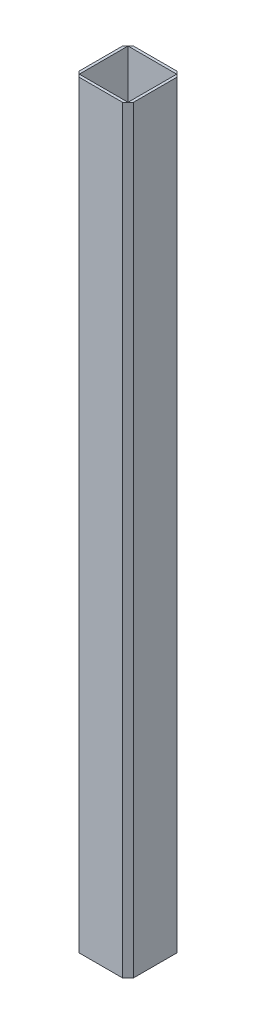
ISO-10303-21;
HEADER;
FILE_DESCRIPTION(('STEP AP214'),'2;1');
FILE_NAME('part.step','',(''),(''),'','','');
FILE_SCHEMA(('AUTOMOTIVE_DESIGN { 1 0 10303 214 1 1 1 1 }'));
ENDSEC;
DATA;
#1=APPLICATION_CONTEXT('core data for automotive mechanical design processes');
#2=APPLICATION_PROTOCOL_DEFINITION('international standard','automotive_design',2000,#1);
#3=PRODUCT_CONTEXT('',#1,'mechanical');
#4=PRODUCT('Part','Part','',(#3));
#5=PRODUCT_RELATED_PRODUCT_CATEGORY('part','',(#4));
#6=PRODUCT_DEFINITION_FORMATION('','',#4);
#7=PRODUCT_DEFINITION_CONTEXT('part definition',#1,'design');
#8=PRODUCT_DEFINITION('design','',#6,#7);
#9=PRODUCT_DEFINITION_SHAPE('','',#8);
#10=(LENGTH_UNIT() NAMED_UNIT(*) SI_UNIT(.MILLI.,.METRE.));
#11=(NAMED_UNIT(*) PLANE_ANGLE_UNIT() SI_UNIT($,.RADIAN.));
#12=(NAMED_UNIT(*) SI_UNIT($,.STERADIAN.) SOLID_ANGLE_UNIT());
#13=UNCERTAINTY_MEASURE_WITH_UNIT(LENGTH_MEASURE(1.E-05),#10,'distance_accuracy_value','');
#14=(GEOMETRIC_REPRESENTATION_CONTEXT(3) GLOBAL_UNCERTAINTY_ASSIGNED_CONTEXT((#13)) GLOBAL_UNIT_ASSIGNED_CONTEXT((#10,
#11,#12)) REPRESENTATION_CONTEXT('',''));
#15=CARTESIAN_POINT('',(0.,0.,0.));
#16=DIRECTION('',(0.,0.,1.));
#17=DIRECTION('',(1.,0.,0.));
#18=AXIS2_PLACEMENT_3D('',#15,#16,#17);
#19=CARTESIAN_POINT('',(0.,700.,50.));
#20=DIRECTION('',(0.,-1.,0.));
#21=DIRECTION('',(0.,0.,-1.));
#22=AXIS2_PLACEMENT_3D('',#19,#20,#21);
#23=PLANE('',#22);
#24=DIRECTION('',(0.,0.,-1.));
#25=VECTOR('',#24,1.);
#26=CARTESIAN_POINT('',(0.,700.,50.));
#27=LINE('',#26,#25);
#28=CARTESIAN_POINT('',(0.,700.,45.));
#29=VERTEX_POINT('',#28);
#30=CARTESIAN_POINT('',(0.,700.,5.00000000000006));
#31=VERTEX_POINT('',#30);
#32=EDGE_CURVE('E248',#29,#31,#27,.T.);
#33=ORIENTED_EDGE('',*,*,#32,.F.);
#34=DIRECTION('',(-0.707106781186551,0.,-0.707106781186544));
#35=VECTOR('',#34,1.);
#36=CARTESIAN_POINT('',(5.00000000000006,700.,50.));
#37=LINE('',#36,#35);
#38=CARTESIAN_POINT('',(2.5,700.,47.5));
#39=VERTEX_POINT('',#38);
#40=EDGE_CURVE('E230',#29,#39,#37,.F.);
#41=ORIENTED_EDGE('',*,*,#40,.T.);
#42=DIRECTION('',(0.,0.,-1.));
#43=VECTOR('',#42,1.);
#44=CARTESIAN_POINT('',(2.5,700.,47.5));
#45=LINE('',#44,#43);
#46=CARTESIAN_POINT('',(2.5,700.,2.5));
#47=VERTEX_POINT('',#46);
#48=EDGE_CURVE('E317',#39,#47,#45,.T.);
#49=ORIENTED_EDGE('',*,*,#48,.T.);
#50=DIRECTION('',(-0.707106781186544,0.,0.707106781186551));
#51=VECTOR('',#50,1.);
#52=CARTESIAN_POINT('',(0.,700.,5.00000000000006));
#53=LINE('',#52,#51);
#54=EDGE_CURVE('E221',#47,#31,#53,.T.);
#55=ORIENTED_EDGE('',*,*,#54,.T.);
#56=EDGE_LOOP('',(#33,#41,#49,#55));
#57=FACE_BOUND('',#56,.T.);
#58=ADVANCED_FACE('F44',(#57),#23,.F.);
#59=DIRECTION('',(-1.,0.,0.));
#60=VECTOR('',#59,1.);
#61=CARTESIAN_POINT('',(0.,700.,0.));
#62=LINE('',#61,#60);
#63=CARTESIAN_POINT('',(45.,700.,0.));
#64=VERTEX_POINT('',#63);
#65=CARTESIAN_POINT('',(5.,700.,0.));
#66=VERTEX_POINT('',#65);
#67=EDGE_CURVE('E291',#64,#66,#62,.T.);
#68=ORIENTED_EDGE('',*,*,#67,.T.);
#69=DIRECTION('',(-0.707106781186544,0.,0.707106781186551));
#70=VECTOR('',#69,1.);
#71=CARTESIAN_POINT('',(0.,700.,5.00000000000006));
#72=LINE('',#71,#70);
#73=EDGE_CURVE('E224',#66,#47,#72,.T.);
#74=ORIENTED_EDGE('',*,*,#73,.T.);
#75=DIRECTION('',(1.,0.,0.));
#76=VECTOR('',#75,1.);
#77=CARTESIAN_POINT('',(2.5,700.,2.5));
#78=LINE('',#77,#76);
#79=CARTESIAN_POINT('',(47.5,700.,2.5));
#80=VERTEX_POINT('',#79);
#81=EDGE_CURVE('E174',#47,#80,#78,.T.);
#82=ORIENTED_EDGE('',*,*,#81,.T.);
#83=DIRECTION('',(-0.707106781186544,0.,-0.707106781186551));
#84=VECTOR('',#83,1.);
#85=CARTESIAN_POINT('',(50.,700.,5.00000000000006));
#86=LINE('',#85,#84);
#87=EDGE_CURVE('E211',#80,#64,#86,.T.);
#88=ORIENTED_EDGE('',*,*,#87,.T.);
#89=EDGE_LOOP('',(#68,#74,#82,#88));
#90=FACE_BOUND('',#89,.T.);
#91=ADVANCED_FACE('F332',(#90),#23,.F.);
#92=DIRECTION('',(-1.,0.,0.));
#93=VECTOR('',#92,1.);
#94=CARTESIAN_POINT('',(47.5,700.,47.5));
#95=LINE('',#94,#93);
#96=CARTESIAN_POINT('',(47.5,700.,47.5));
#97=VERTEX_POINT('',#96);
#98=EDGE_CURVE('E164',#97,#39,#95,.T.);
#99=ORIENTED_EDGE('',*,*,#98,.T.);
#100=DIRECTION('',(-0.707106781186551,0.,-0.707106781186544));
#101=VECTOR('',#100,1.);
#102=CARTESIAN_POINT('',(5.00000000000006,700.,50.));
#103=LINE('',#102,#101);
#104=CARTESIAN_POINT('',(5.00000000000006,700.,50.));
#105=VERTEX_POINT('',#104);
#106=EDGE_CURVE('E227',#39,#105,#103,.F.);
#107=ORIENTED_EDGE('',*,*,#106,.T.);
#108=DIRECTION('',(-1.,0.,0.));
#109=VECTOR('',#108,1.);
#110=CARTESIAN_POINT('',(0.,700.,50.));
#111=LINE('',#110,#109);
#112=CARTESIAN_POINT('',(44.9999999999999,700.,50.));
#113=VERTEX_POINT('',#112);
#114=EDGE_CURVE('E254',#113,#105,#111,.T.);
#115=ORIENTED_EDGE('',*,*,#114,.F.);
#116=DIRECTION('',(-0.707106781186544,0.,0.707106781186551));
#117=VECTOR('',#116,1.);
#118=CARTESIAN_POINT('',(44.9999999999999,700.,50.));
#119=LINE('',#118,#117);
#120=EDGE_CURVE('E218',#113,#97,#119,.F.);
#121=ORIENTED_EDGE('',*,*,#120,.T.);
#122=EDGE_LOOP('',(#99,#107,#115,#121));
#123=FACE_BOUND('',#122,.T.);
#124=ADVANCED_FACE('F297',(#123),#23,.F.);
#125=CARTESIAN_POINT('',(0.,0.,50.));
#126=DIRECTION('',(0.,1.,0.));
#127=DIRECTION('',(0.,0.,1.));
#128=AXIS2_PLACEMENT_3D('',#125,#126,#127);
#129=PLANE('',#128);
#130=DIRECTION('',(1.,0.,0.));
#131=VECTOR('',#130,1.);
#132=CARTESIAN_POINT('',(0.,0.,50.));
#133=LINE('',#132,#131);
#134=CARTESIAN_POINT('',(5.00000000000006,0.,50.));
#135=VERTEX_POINT('',#134);
#136=CARTESIAN_POINT('',(44.9999999999999,0.,50.));
#137=VERTEX_POINT('',#136);
#138=EDGE_CURVE('E279',#135,#137,#133,.T.);
#139=ORIENTED_EDGE('',*,*,#138,.F.);
#140=DIRECTION('',(0.707106781186551,0.,0.707106781186544));
#141=VECTOR('',#140,1.);
#142=CARTESIAN_POINT('',(5.00000000000006,0.,50.));
#143=LINE('',#142,#141);
#144=CARTESIAN_POINT('',(2.5,0.,47.5));
#145=VERTEX_POINT('',#144);
#146=EDGE_CURVE('E202',#135,#145,#143,.F.);
#147=ORIENTED_EDGE('',*,*,#146,.T.);
#148=DIRECTION('',(-1.,0.,0.));
#149=VECTOR('',#148,1.);
#150=CARTESIAN_POINT('',(47.5,0.,47.5));
#151=LINE('',#150,#149);
#152=CARTESIAN_POINT('',(47.5,0.,47.5));
#153=VERTEX_POINT('',#152);
#154=EDGE_CURVE('E281',#153,#145,#151,.T.);
#155=ORIENTED_EDGE('',*,*,#154,.F.);
#156=DIRECTION('',(0.707106781186544,0.,-0.707106781186551));
#157=VECTOR('',#156,1.);
#158=CARTESIAN_POINT('',(44.9999999999999,0.,50.));
#159=LINE('',#158,#157);
#160=EDGE_CURVE('E196',#153,#137,#159,.F.);
#161=ORIENTED_EDGE('',*,*,#160,.T.);
#162=EDGE_LOOP('',(#139,#147,#155,#161));
#163=FACE_BOUND('',#162,.T.);
#164=ADVANCED_FACE('F278',(#163),#129,.F.);
#165=DIRECTION('',(0.,0.,-1.));
#166=VECTOR('',#165,1.);
#167=CARTESIAN_POINT('',(2.5,0.,47.5));
#168=LINE('',#167,#166);
#169=CARTESIAN_POINT('',(2.5,0.,2.5));
#170=VERTEX_POINT('',#169);
#171=EDGE_CURVE('E140',#145,#170,#168,.T.);
#172=ORIENTED_EDGE('',*,*,#171,.F.);
#173=DIRECTION('',(0.707106781186551,0.,0.707106781186544));
#174=VECTOR('',#173,1.);
#175=CARTESIAN_POINT('',(5.00000000000006,0.,50.));
#176=LINE('',#175,#174);
#177=CARTESIAN_POINT('',(0.,0.,45.));
#178=VERTEX_POINT('',#177);
#179=EDGE_CURVE('E149',#145,#178,#176,.F.);
#180=ORIENTED_EDGE('',*,*,#179,.T.);
#181=DIRECTION('',(0.,0.,-1.));
#182=VECTOR('',#181,1.);
#183=CARTESIAN_POINT('',(0.,0.,50.));
#184=LINE('',#183,#182);
#185=CARTESIAN_POINT('',(0.,0.,5.00000000000006));
#186=VERTEX_POINT('',#185);
#187=EDGE_CURVE('E143',#178,#186,#184,.T.);
#188=ORIENTED_EDGE('',*,*,#187,.T.);
#189=DIRECTION('',(0.707106781186544,0.,-0.707106781186551));
#190=VECTOR('',#189,1.);
#191=CARTESIAN_POINT('',(0.,0.,5.00000000000006));
#192=LINE('',#191,#190);
#193=EDGE_CURVE('E137',#186,#170,#192,.T.);
#194=ORIENTED_EDGE('',*,*,#193,.T.);
#195=EDGE_LOOP('',(#172,#180,#188,#194));
#196=FACE_BOUND('',#195,.T.);
#197=ADVANCED_FACE('F139',(#196),#129,.F.);
#198=DIRECTION('',(0.,0.,-1.));
#199=VECTOR('',#198,1.);
#200=CARTESIAN_POINT('',(50.,0.,50.));
#201=LINE('',#200,#199);
#202=CARTESIAN_POINT('',(50.,0.,44.9999999999999));
#203=VERTEX_POINT('',#202);
#204=CARTESIAN_POINT('',(50.,0.,5.00000000000006));
#205=VERTEX_POINT('',#204);
#206=EDGE_CURVE('E244',#203,#205,#201,.T.);
#207=ORIENTED_EDGE('',*,*,#206,.F.);
#208=DIRECTION('',(0.707106781186544,0.,-0.707106781186551));
#209=VECTOR('',#208,1.);
#210=CARTESIAN_POINT('',(44.9999999999999,0.,50.));
#211=LINE('',#210,#209);
#212=EDGE_CURVE('E193',#203,#153,#211,.F.);
#213=ORIENTED_EDGE('',*,*,#212,.T.);
#214=DIRECTION('',(0.,0.,1.));
#215=VECTOR('',#214,1.);
#216=CARTESIAN_POINT('',(47.5,0.,2.5));
#217=LINE('',#216,#215);
#218=CARTESIAN_POINT('',(47.5,0.,2.5));
#219=VERTEX_POINT('',#218);
#220=EDGE_CURVE('E186',#219,#153,#217,.T.);
#221=ORIENTED_EDGE('',*,*,#220,.F.);
#222=DIRECTION('',(0.707106781186544,0.,0.707106781186551));
#223=VECTOR('',#222,1.);
#224=CARTESIAN_POINT('',(50.,0.,5.00000000000006));
#225=LINE('',#224,#223);
#226=EDGE_CURVE('E268',#219,#205,#225,.T.);
#227=ORIENTED_EDGE('',*,*,#226,.T.);
#228=EDGE_LOOP('',(#207,#213,#221,#227));
#229=FACE_BOUND('',#228,.T.);
#230=ADVANCED_FACE('F371',(#229),#129,.F.);
#231=DIRECTION('',(1.,0.,0.));
#232=VECTOR('',#231,1.);
#233=CARTESIAN_POINT('',(2.5,0.,2.5));
#234=LINE('',#233,#232);
#235=EDGE_CURVE('E163',#170,#219,#234,.T.);
#236=ORIENTED_EDGE('',*,*,#235,.F.);
#237=DIRECTION('',(0.707106781186544,0.,-0.707106781186551));
#238=VECTOR('',#237,1.);
#239=CARTESIAN_POINT('',(0.,0.,5.00000000000006));
#240=LINE('',#239,#238);
#241=CARTESIAN_POINT('',(5.,0.,0.));
#242=VERTEX_POINT('',#241);
#243=EDGE_CURVE('E150',#170,#242,#240,.T.);
#244=ORIENTED_EDGE('',*,*,#243,.T.);
#245=DIRECTION('',(1.,0.,0.));
#246=VECTOR('',#245,1.);
#247=CARTESIAN_POINT('',(0.,0.,0.));
#248=LINE('',#247,#246);
#249=CARTESIAN_POINT('',(45.,0.,0.));
#250=VERTEX_POINT('',#249);
#251=EDGE_CURVE('E176',#242,#250,#248,.T.);
#252=ORIENTED_EDGE('',*,*,#251,.T.);
#253=DIRECTION('',(0.707106781186544,0.,0.707106781186551));
#254=VECTOR('',#253,1.);
#255=CARTESIAN_POINT('',(50.,0.,5.00000000000006));
#256=LINE('',#255,#254);
#257=EDGE_CURVE('E184',#250,#219,#256,.T.);
#258=ORIENTED_EDGE('',*,*,#257,.T.);
#259=EDGE_LOOP('',(#236,#244,#252,#258));
#260=FACE_BOUND('',#259,.T.);
#261=ADVANCED_FACE('F180',(#260),#129,.F.);
#262=DIRECTION('',(0.,0.,1.));
#263=VECTOR('',#262,1.);
#264=CARTESIAN_POINT('',(47.5,700.,2.5));
#265=LINE('',#264,#263);
#266=EDGE_CURVE('E306',#80,#97,#265,.T.);
#267=ORIENTED_EDGE('',*,*,#266,.T.);
#268=DIRECTION('',(-0.707106781186544,0.,0.707106781186551));
#269=VECTOR('',#268,1.);
#270=CARTESIAN_POINT('',(44.9999999999999,700.,50.));
#271=LINE('',#270,#269);
#272=CARTESIAN_POINT('',(50.,700.,44.9999999999999));
#273=VERTEX_POINT('',#272);
#274=EDGE_CURVE('E69',#97,#273,#271,.F.);
#275=ORIENTED_EDGE('',*,*,#274,.T.);
#276=DIRECTION('',(0.,0.,-1.));
#277=VECTOR('',#276,1.);
#278=CARTESIAN_POINT('',(50.,700.,50.));
#279=LINE('',#278,#277);
#280=CARTESIAN_POINT('',(50.,700.,5.00000000000006));
#281=VERTEX_POINT('',#280);
#282=EDGE_CURVE('E241',#273,#281,#279,.T.);
#283=ORIENTED_EDGE('',*,*,#282,.T.);
#284=DIRECTION('',(-0.707106781186544,0.,-0.707106781186551));
#285=VECTOR('',#284,1.);
#286=CARTESIAN_POINT('',(50.,700.,5.00000000000006));
#287=LINE('',#286,#285);
#288=EDGE_CURVE('E61',#281,#80,#287,.T.);
#289=ORIENTED_EDGE('',*,*,#288,.T.);
#290=EDGE_LOOP('',(#267,#275,#283,#289));
#291=FACE_BOUND('',#290,.T.);
#292=ADVANCED_FACE('F246',(#291),#23,.F.);
#293=CARTESIAN_POINT('',(0.,0.,50.));
#294=DIRECTION('',(1.,0.,0.));
#295=DIRECTION('',(0.,0.,-1.));
#296=AXIS2_PLACEMENT_3D('',#293,#294,#295);
#297=PLANE('',#296);
#298=ORIENTED_EDGE('',*,*,#187,.F.);
#299=DIRECTION('',(0.,1.,0.));
#300=VECTOR('',#299,1.);
#301=CARTESIAN_POINT('',(0.,0.,45.));
#302=LINE('',#301,#300);
#303=EDGE_CURVE('E208',#178,#29,#302,.T.);
#304=ORIENTED_EDGE('',*,*,#303,.T.);
#305=ORIENTED_EDGE('',*,*,#32,.T.);
#306=DIRECTION('',(0.,-1.,0.));
#307=VECTOR('',#306,1.);
#308=CARTESIAN_POINT('',(0.,0.,5.00000000000006));
#309=LINE('',#308,#307);
#310=EDGE_CURVE('E205',#31,#186,#309,.T.);
#311=ORIENTED_EDGE('',*,*,#310,.T.);
#312=EDGE_LOOP('',(#298,#304,#305,#311));
#313=FACE_BOUND('',#312,.T.);
#314=ADVANCED_FACE('F340',(#313),#297,.F.);
#315=CARTESIAN_POINT('',(50.,0.,50.));
#316=DIRECTION('',(-1.,0.,0.));
#317=DIRECTION('',(0.,0.,1.));
#318=AXIS2_PLACEMENT_3D('',#315,#316,#317);
#319=PLANE('',#318);
#320=ORIENTED_EDGE('',*,*,#282,.F.);
#321=DIRECTION('',(0.,-1.,0.));
#322=VECTOR('',#321,1.);
#323=CARTESIAN_POINT('',(50.,0.,44.9999999999999));
#324=LINE('',#323,#322);
#325=EDGE_CURVE('E11',#273,#203,#324,.T.);
#326=ORIENTED_EDGE('',*,*,#325,.T.);
#327=ORIENTED_EDGE('',*,*,#206,.T.);
#328=DIRECTION('',(0.,1.,0.));
#329=VECTOR('',#328,1.);
#330=CARTESIAN_POINT('',(50.,700.,5.00000000000006));
#331=LINE('',#330,#329);
#332=EDGE_CURVE('E54',#205,#281,#331,.T.);
#333=ORIENTED_EDGE('',*,*,#332,.T.);
#334=EDGE_LOOP('',(#320,#326,#327,#333));
#335=FACE_BOUND('',#334,.T.);
#336=ADVANCED_FACE('F240',(#335),#319,.F.);
#337=CARTESIAN_POINT('',(0.,0.,50.));
#338=DIRECTION('',(0.,0.,-1.));
#339=DIRECTION('',(-1.,0.,0.));
#340=AXIS2_PLACEMENT_3D('',#337,#338,#339);
#341=PLANE('',#340);
#342=ORIENTED_EDGE('',*,*,#114,.T.);
#343=DIRECTION('',(0.,-1.,0.));
#344=VECTOR('',#343,1.);
#345=CARTESIAN_POINT('',(5.00000000000006,0.,50.));
#346=LINE('',#345,#344);
#347=EDGE_CURVE('E264',#105,#135,#346,.T.);
#348=ORIENTED_EDGE('',*,*,#347,.T.);
#349=ORIENTED_EDGE('',*,*,#138,.T.);
#350=DIRECTION('',(0.,1.,0.));
#351=VECTOR('',#350,1.);
#352=CARTESIAN_POINT('',(44.9999999999999,0.,50.));
#353=LINE('',#352,#351);
#354=EDGE_CURVE('E260',#137,#113,#353,.T.);
#355=ORIENTED_EDGE('',*,*,#354,.T.);
#356=EDGE_LOOP('',(#342,#348,#349,#355));
#357=FACE_BOUND('',#356,.T.);
#358=ADVANCED_FACE('F287',(#357),#341,.F.);
#359=CARTESIAN_POINT('',(0.,0.,0.));
#360=DIRECTION('',(0.,0.,-1.));
#361=DIRECTION('',(-1.,0.,0.));
#362=AXIS2_PLACEMENT_3D('',#359,#360,#361);
#363=PLANE('',#362);
#364=ORIENTED_EDGE('',*,*,#251,.F.);
#365=DIRECTION('',(0.,1.,0.));
#366=VECTOR('',#365,1.);
#367=CARTESIAN_POINT('',(5.,700.,0.));
#368=LINE('',#367,#366);
#369=EDGE_CURVE('E191',#242,#66,#368,.T.);
#370=ORIENTED_EDGE('',*,*,#369,.T.);
#371=ORIENTED_EDGE('',*,*,#67,.F.);
#372=DIRECTION('',(0.,-1.,0.));
#373=VECTOR('',#372,1.);
#374=CARTESIAN_POINT('',(45.,0.,0.));
#375=LINE('',#374,#373);
#376=EDGE_CURVE('E233',#64,#250,#375,.T.);
#377=ORIENTED_EDGE('',*,*,#376,.T.);
#378=EDGE_LOOP('',(#364,#370,#371,#377));
#379=FACE_BOUND('',#378,.T.);
#380=ADVANCED_FACE('F384',(#379),#363,.T.);
#381=CARTESIAN_POINT('',(2.5,0.,47.5));
#382=DIRECTION('',(1.,0.,0.));
#383=DIRECTION('',(0.,0.,-1.));
#384=AXIS2_PLACEMENT_3D('',#381,#382,#383);
#385=PLANE('',#384);
#386=ORIENTED_EDGE('',*,*,#48,.F.);
#387=DIRECTION('',(0.,1.,0.));
#388=VECTOR('',#387,1.);
#389=CARTESIAN_POINT('',(2.5,0.,47.5));
#390=LINE('',#389,#388);
#391=EDGE_CURVE('E161',#145,#39,#390,.T.);
#392=ORIENTED_EDGE('',*,*,#391,.F.);
#393=ORIENTED_EDGE('',*,*,#171,.T.);
#394=DIRECTION('',(0.,1.,0.));
#395=VECTOR('',#394,1.);
#396=CARTESIAN_POINT('',(2.5,0.,2.5));
#397=LINE('',#396,#395);
#398=EDGE_CURVE('E158',#170,#47,#397,.T.);
#399=ORIENTED_EDGE('',*,*,#398,.T.);
#400=EDGE_LOOP('',(#386,#392,#393,#399));
#401=FACE_BOUND('',#400,.T.);
#402=ADVANCED_FACE('F157',(#401),#385,.T.);
#403=CARTESIAN_POINT('',(2.5,0.,2.5));
#404=DIRECTION('',(0.,0.,1.));
#405=DIRECTION('',(1.,0.,0.));
#406=AXIS2_PLACEMENT_3D('',#403,#404,#405);
#407=PLANE('',#406);
#408=ORIENTED_EDGE('',*,*,#81,.F.);
#409=ORIENTED_EDGE('',*,*,#398,.F.);
#410=ORIENTED_EDGE('',*,*,#235,.T.);
#411=DIRECTION('',(0.,1.,0.));
#412=VECTOR('',#411,1.);
#413=CARTESIAN_POINT('',(47.5,0.,2.5));
#414=LINE('',#413,#412);
#415=EDGE_CURVE('E177',#219,#80,#414,.T.);
#416=ORIENTED_EDGE('',*,*,#415,.T.);
#417=EDGE_LOOP('',(#408,#409,#410,#416));
#418=FACE_BOUND('',#417,.T.);
#419=ADVANCED_FACE('F170',(#418),#407,.T.);
#420=CARTESIAN_POINT('',(47.5,0.,2.5));
#421=DIRECTION('',(-1.,0.,0.));
#422=DIRECTION('',(0.,0.,1.));
#423=AXIS2_PLACEMENT_3D('',#420,#421,#422);
#424=PLANE('',#423);
#425=ORIENTED_EDGE('',*,*,#266,.F.);
#426=ORIENTED_EDGE('',*,*,#415,.F.);
#427=ORIENTED_EDGE('',*,*,#220,.T.);
#428=DIRECTION('',(0.,1.,0.));
#429=VECTOR('',#428,1.);
#430=CARTESIAN_POINT('',(47.5,0.,47.5));
#431=LINE('',#430,#429);
#432=EDGE_CURVE('E304',#153,#97,#431,.T.);
#433=ORIENTED_EDGE('',*,*,#432,.T.);
#434=EDGE_LOOP('',(#425,#426,#427,#433));
#435=FACE_BOUND('',#434,.T.);
#436=ADVANCED_FACE('F305',(#435),#424,.T.);
#437=CARTESIAN_POINT('',(47.5,0.,47.5));
#438=DIRECTION('',(0.,0.,-1.));
#439=DIRECTION('',(-1.,0.,0.));
#440=AXIS2_PLACEMENT_3D('',#437,#438,#439);
#441=PLANE('',#440);
#442=ORIENTED_EDGE('',*,*,#98,.F.);
#443=ORIENTED_EDGE('',*,*,#432,.F.);
#444=ORIENTED_EDGE('',*,*,#154,.T.);
#445=ORIENTED_EDGE('',*,*,#391,.T.);
#446=EDGE_LOOP('',(#442,#443,#444,#445));
#447=FACE_BOUND('',#446,.T.);
#448=ADVANCED_FACE('F311',(#447),#441,.T.);
#449=CARTESIAN_POINT('',(5.00000000000006,0.,50.));
#450=DIRECTION('',(0.707106781186543,0.,-0.707106781186551));
#451=DIRECTION('',(0.,-1.,0.));
#452=AXIS2_PLACEMENT_3D('',#449,#450,#451);
#453=PLANE('',#452);
#454=ORIENTED_EDGE('',*,*,#40,.F.);
#455=ORIENTED_EDGE('',*,*,#303,.F.);
#456=ORIENTED_EDGE('',*,*,#179,.F.);
#457=ORIENTED_EDGE('',*,*,#146,.F.);
#458=ORIENTED_EDGE('',*,*,#347,.F.);
#459=ORIENTED_EDGE('',*,*,#106,.F.);
#460=EDGE_LOOP('',(#454,#455,#456,#457,#458,#459));
#461=FACE_BOUND('',#460,.T.);
#462=ADVANCED_FACE('F343',(#461),#453,.F.);
#463=CARTESIAN_POINT('',(0.,0.,5.00000000000006));
#464=DIRECTION('',(-0.707106781186551,0.,-0.707106781186543));
#465=DIRECTION('',(0.,1.,0.));
#466=AXIS2_PLACEMENT_3D('',#463,#464,#465);
#467=PLANE('',#466);
#468=ORIENTED_EDGE('',*,*,#73,.F.);
#469=ORIENTED_EDGE('',*,*,#369,.F.);
#470=ORIENTED_EDGE('',*,*,#243,.F.);
#471=ORIENTED_EDGE('',*,*,#193,.F.);
#472=ORIENTED_EDGE('',*,*,#310,.F.);
#473=ORIENTED_EDGE('',*,*,#54,.F.);
#474=EDGE_LOOP('',(#468,#469,#470,#471,#472,#473));
#475=FACE_BOUND('',#474,.T.);
#476=ADVANCED_FACE('F190',(#475),#467,.T.);
#477=CARTESIAN_POINT('',(44.9999999999999,0.,50.));
#478=DIRECTION('',(-0.707106781186551,0.,-0.707106781186544));
#479=DIRECTION('',(0.,1.,0.));
#480=AXIS2_PLACEMENT_3D('',#477,#478,#479);
#481=PLANE('',#480);
#482=ORIENTED_EDGE('',*,*,#212,.F.);
#483=ORIENTED_EDGE('',*,*,#325,.F.);
#484=ORIENTED_EDGE('',*,*,#274,.F.);
#485=ORIENTED_EDGE('',*,*,#120,.F.);
#486=ORIENTED_EDGE('',*,*,#354,.F.);
#487=ORIENTED_EDGE('',*,*,#160,.F.);
#488=EDGE_LOOP('',(#482,#483,#484,#485,#486,#487));
#489=FACE_BOUND('',#488,.T.);
#490=ADVANCED_FACE('F293',(#489),#481,.F.);
#491=CARTESIAN_POINT('',(50.,0.,5.00000000000006));
#492=DIRECTION('',(0.707106781186551,0.,-0.707106781186543));
#493=DIRECTION('',(0.,-1.,0.));
#494=AXIS2_PLACEMENT_3D('',#491,#492,#493);
#495=PLANE('',#494);
#496=ORIENTED_EDGE('',*,*,#257,.F.);
#497=ORIENTED_EDGE('',*,*,#376,.F.);
#498=ORIENTED_EDGE('',*,*,#87,.F.);
#499=ORIENTED_EDGE('',*,*,#288,.F.);
#500=ORIENTED_EDGE('',*,*,#332,.F.);
#501=ORIENTED_EDGE('',*,*,#226,.F.);
#502=EDGE_LOOP('',(#496,#497,#498,#499,#500,#501));
#503=FACE_BOUND('',#502,.T.);
#504=ADVANCED_FACE('F47',(#503),#495,.T.);
#505=CLOSED_SHELL('',(#58,#91,#124,#164,#197,#230,#261,#292,#314,#336,#358,#380,#402,#419,#436,
#448,#462,#476,#490,#504));
#506=MANIFOLD_SOLID_BREP('B2',#505);
#507=ADVANCED_BREP_SHAPE_REPRESENTATION('',(#18,#506),#14);
#508=SHAPE_DEFINITION_REPRESENTATION(#9,#507);
ENDSEC;
END-ISO-10303-21;
